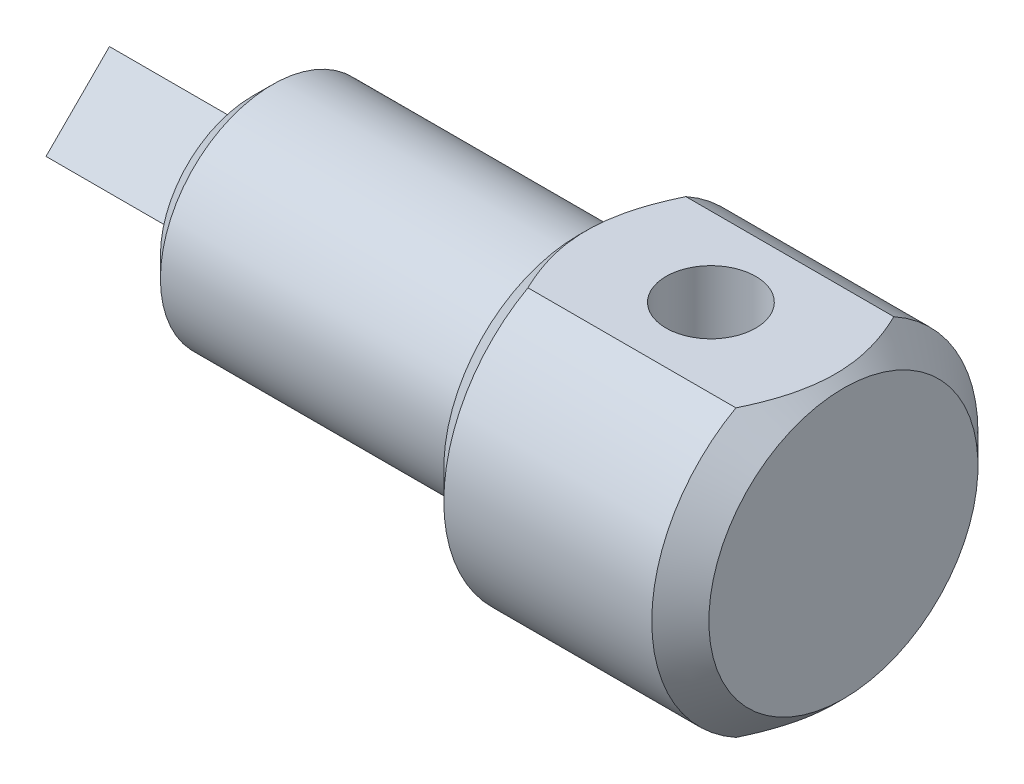
ISO-10303-21;
HEADER;
FILE_DESCRIPTION(('STEP AP214'),'2;1');
FILE_NAME('part.step','',(''),(''),'','','');
FILE_SCHEMA(('AUTOMOTIVE_DESIGN { 1 0 10303 214 1 1 1 1 }'));
ENDSEC;
DATA;
#1=APPLICATION_CONTEXT('core data for automotive mechanical design processes');
#2=APPLICATION_PROTOCOL_DEFINITION('international standard','automotive_design',2000,#1);
#3=PRODUCT_CONTEXT('',#1,'mechanical');
#4=PRODUCT('Part','Part','',(#3));
#5=PRODUCT_RELATED_PRODUCT_CATEGORY('part','',(#4));
#6=PRODUCT_DEFINITION_FORMATION('','',#4);
#7=PRODUCT_DEFINITION_CONTEXT('part definition',#1,'design');
#8=PRODUCT_DEFINITION('design','',#6,#7);
#9=PRODUCT_DEFINITION_SHAPE('','',#8);
#10=(LENGTH_UNIT() NAMED_UNIT(*) SI_UNIT(.MILLI.,.METRE.));
#11=(NAMED_UNIT(*) PLANE_ANGLE_UNIT() SI_UNIT($,.RADIAN.));
#12=(NAMED_UNIT(*) SI_UNIT($,.STERADIAN.) SOLID_ANGLE_UNIT());
#13=UNCERTAINTY_MEASURE_WITH_UNIT(LENGTH_MEASURE(1.E-05),#10,'distance_accuracy_value','');
#14=(GEOMETRIC_REPRESENTATION_CONTEXT(3) GLOBAL_UNCERTAINTY_ASSIGNED_CONTEXT((#13)) GLOBAL_UNIT_ASSIGNED_CONTEXT((#10,
#11,#12)) REPRESENTATION_CONTEXT('',''));
#15=CARTESIAN_POINT('',(0.,0.,0.));
#16=DIRECTION('',(0.,0.,1.));
#17=DIRECTION('',(1.,0.,0.));
#18=AXIS2_PLACEMENT_3D('',#15,#16,#17);
#19=CARTESIAN_POINT('',(0.,0.,0.));
#20=DIRECTION('',(1.,0.,0.));
#21=DIRECTION('',(0.,0.,-1.));
#22=AXIS2_PLACEMENT_3D('',#19,#20,#21);
#23=CYLINDRICAL_SURFACE('',#22,40.);
#24=DIRECTION('',(-1.,0.,0.));
#25=VECTOR('',#24,1.);
#26=CARTESIAN_POINT('',(489.715486354475,-35.,19.3649167310371));
#27=LINE('',#26,#25);
#28=CARTESIAN_POINT('',(138.,-35.,19.3649167310371));
#29=VERTEX_POINT('',#28);
#30=CARTESIAN_POINT('',(87.,-35.,19.3649167310371));
#31=VERTEX_POINT('',#30);
#32=EDGE_CURVE('E324',#29,#31,#27,.T.);
#33=ORIENTED_EDGE('',*,*,#32,.F.);
#34=CARTESIAN_POINT('',(138.,0.,0.));
#35=DIRECTION('',(-1.,0.,0.));
#36=DIRECTION('',(0.,0.,1.));
#37=AXIS2_PLACEMENT_3D('',#34,#35,#36);
#38=CIRCLE('',#37,40.);
#39=CARTESIAN_POINT('',(138.,35.,19.3649167310371));
#40=VERTEX_POINT('',#39);
#41=EDGE_CURVE('E327',#29,#40,#38,.T.);
#42=ORIENTED_EDGE('',*,*,#41,.T.);
#43=DIRECTION('',(-1.,0.,0.));
#44=VECTOR('',#43,1.);
#45=CARTESIAN_POINT('',(592.003645318366,35.,19.3649167310371));
#46=LINE('',#45,#44);
#47=CARTESIAN_POINT('',(87.0000000000002,35.,19.3649167310371));
#48=VERTEX_POINT('',#47);
#49=EDGE_CURVE('E341',#40,#48,#46,.T.);
#50=ORIENTED_EDGE('',*,*,#49,.T.);
#51=CARTESIAN_POINT('',(87.,0.,0.));
#52=DIRECTION('',(1.,0.,0.));
#53=DIRECTION('',(0.,0.,-1.));
#54=AXIS2_PLACEMENT_3D('',#51,#52,#53);
#55=CIRCLE('',#54,40.);
#56=EDGE_CURVE('E330',#48,#31,#55,.T.);
#57=ORIENTED_EDGE('',*,*,#56,.T.);
#58=EDGE_LOOP('',(#33,#42,#50,#57));
#59=FACE_BOUND('',#58,.T.);
#60=ADVANCED_FACE('F35',(#59),#23,.T.);
#61=CARTESIAN_POINT('',(80.,27.5,0.));
#62=DIRECTION('',(-1.,0.,0.));
#63=DIRECTION('',(0.,0.,1.));
#64=AXIS2_PLACEMENT_3D('',#61,#62,#63);
#65=PLANE('',#64);
#66=CARTESIAN_POINT('',(80.,0.,0.));
#67=DIRECTION('',(-1.,0.,0.));
#68=DIRECTION('',(0.,0.,1.));
#69=AXIS2_PLACEMENT_3D('',#66,#67,#68);
#70=CIRCLE('',#69,33.);
#71=CARTESIAN_POINT('',(80.,-28.875,-15.9760563031056));
#72=VERTEX_POINT('',#71);
#73=EDGE_CURVE('E48',#72,#72,#70,.T.);
#74=ORIENTED_EDGE('',*,*,#73,.T.);
#75=EDGE_LOOP('',(#74));
#76=FACE_BOUND('',#75,.T.);
#77=CARTESIAN_POINT('',(80.,0.,0.));
#78=DIRECTION('',(1.,0.,0.));
#79=DIRECTION('',(0.,0.,-1.));
#80=AXIS2_PLACEMENT_3D('',#77,#78,#79);
#81=CIRCLE('',#80,27.5);
#82=CARTESIAN_POINT('',(80.,0.,-27.5));
#83=VERTEX_POINT('',#82);
#84=EDGE_CURVE('E197',#83,#83,#81,.T.);
#85=ORIENTED_EDGE('',*,*,#84,.T.);
#86=EDGE_LOOP('',(#85));
#87=FACE_BOUND('',#86,.T.);
#88=ADVANCED_FACE('F276',(#76,#87),#65,.T.);
#89=DIRECTION('',(-1.,0.,0.));
#90=VECTOR('',#89,1.);
#91=CARTESIAN_POINT('',(592.003645318366,35.,-19.3649167310371));
#92=LINE('',#91,#90);
#93=CARTESIAN_POINT('',(138.,35.,-19.3649167310371));
#94=VERTEX_POINT('',#93);
#95=CARTESIAN_POINT('',(87.0000000000002,35.,-19.3649167310371));
#96=VERTEX_POINT('',#95);
#97=EDGE_CURVE('E159',#94,#96,#92,.T.);
#98=ORIENTED_EDGE('',*,*,#97,.F.);
#99=CARTESIAN_POINT('',(138.,0.,0.));
#100=DIRECTION('',(1.,0.,0.));
#101=DIRECTION('',(0.,0.,-1.));
#102=AXIS2_PLACEMENT_3D('',#99,#100,#101);
#103=CIRCLE('',#102,40.);
#104=CARTESIAN_POINT('',(138.,-35.,-19.3649167310371));
#105=VERTEX_POINT('',#104);
#106=EDGE_CURVE('E211',#94,#105,#103,.F.);
#107=ORIENTED_EDGE('',*,*,#106,.T.);
#108=DIRECTION('',(-1.,0.,0.));
#109=VECTOR('',#108,1.);
#110=CARTESIAN_POINT('',(489.715486354475,-35.,-19.3649167310371));
#111=LINE('',#110,#109);
#112=CARTESIAN_POINT('',(87.,-35.,-19.3649167310371));
#113=VERTEX_POINT('',#112);
#114=EDGE_CURVE('E333',#105,#113,#111,.T.);
#115=ORIENTED_EDGE('',*,*,#114,.T.);
#116=CARTESIAN_POINT('',(87.,0.,0.));
#117=DIRECTION('',(-1.,0.,0.));
#118=DIRECTION('',(0.,0.,1.));
#119=AXIS2_PLACEMENT_3D('',#116,#117,#118);
#120=CIRCLE('',#119,40.);
#121=EDGE_CURVE('E208',#113,#96,#120,.F.);
#122=ORIENTED_EDGE('',*,*,#121,.T.);
#123=EDGE_LOOP('',(#98,#107,#115,#122));
#124=FACE_BOUND('',#123,.T.);
#125=ADVANCED_FACE('F279',(#124),#23,.T.);
#126=CARTESIAN_POINT('',(145.,40.,0.));
#127=DIRECTION('',(1.,0.,0.));
#128=DIRECTION('',(0.,0.,-1.));
#129=AXIS2_PLACEMENT_3D('',#126,#127,#128);
#130=PLANE('',#129);
#131=CARTESIAN_POINT('',(145.,0.,0.));
#132=DIRECTION('',(1.,0.,0.));
#133=DIRECTION('',(0.,0.,-1.));
#134=AXIS2_PLACEMENT_3D('',#131,#132,#133);
#135=CIRCLE('',#134,33.);
#136=CARTESIAN_POINT('',(145.,-28.875,-15.9760563031056));
#137=VERTEX_POINT('',#136);
#138=EDGE_CURVE('E53',#137,#137,#135,.T.);
#139=ORIENTED_EDGE('',*,*,#138,.T.);
#140=EDGE_LOOP('',(#139));
#141=FACE_BOUND('',#140,.T.);
#142=ADVANCED_FACE('F274',(#141),#130,.T.);
#143=CARTESIAN_POINT('',(0.,0.,0.));
#144=DIRECTION('',(1.,0.,0.));
#145=DIRECTION('',(0.,0.,-1.));
#146=AXIS2_PLACEMENT_3D('',#143,#144,#145);
#147=CYLINDRICAL_SURFACE('',#146,27.5);
#148=CARTESIAN_POINT('',(5.,0.,0.));
#149=DIRECTION('',(-1.,0.,0.));
#150=DIRECTION('',(0.,0.,1.));
#151=AXIS2_PLACEMENT_3D('',#148,#149,#150);
#152=CIRCLE('',#151,27.5);
#153=CARTESIAN_POINT('',(5.,0.,27.5));
#154=VERTEX_POINT('',#153);
#155=EDGE_CURVE('E43',#154,#154,#152,.F.);
#156=ORIENTED_EDGE('',*,*,#155,.T.);
#157=EDGE_LOOP('',(#156));
#158=FACE_BOUND('',#157,.T.);
#159=ORIENTED_EDGE('',*,*,#84,.F.);
#160=EDGE_LOOP('',(#159));
#161=FACE_BOUND('',#160,.T.);
#162=CARTESIAN_POINT('',(15.,0.,0.));
#163=DIRECTION('',(-1.,0.,0.));
#164=DIRECTION('',(0.,0.,1.));
#165=AXIS2_PLACEMENT_3D('',#162,#163,#164);
#166=CIRCLE('',#165,27.5);
#167=CARTESIAN_POINT('',(15.,-8.,-26.3106442338457));
#168=VERTEX_POINT('',#167);
#169=CARTESIAN_POINT('',(15.,8.,-26.3106442338457));
#170=VERTEX_POINT('',#169);
#171=EDGE_CURVE('E204',#168,#170,#166,.F.);
#172=ORIENTED_EDGE('',*,*,#171,.F.);
#173=DIRECTION('',(1.,0.,0.));
#174=VECTOR('',#173,1.);
#175=CARTESIAN_POINT('',(0.,-8.,-26.3106442338457));
#176=LINE('',#175,#174);
#177=CARTESIAN_POINT('',(60.,-8.,-26.3106442338457));
#178=VERTEX_POINT('',#177);
#179=EDGE_CURVE('E136',#168,#178,#176,.T.);
#180=ORIENTED_EDGE('',*,*,#179,.T.);
#181=CARTESIAN_POINT('',(60.,0.,0.));
#182=DIRECTION('',(1.,0.,0.));
#183=DIRECTION('',(0.,0.,-1.));
#184=AXIS2_PLACEMENT_3D('',#181,#182,#183);
#185=CIRCLE('',#184,27.5);
#186=CARTESIAN_POINT('',(60.,8.,-26.3106442338457));
#187=VERTEX_POINT('',#186);
#188=EDGE_CURVE('E202',#187,#178,#185,.F.);
#189=ORIENTED_EDGE('',*,*,#188,.F.);
#190=DIRECTION('',(1.,0.,0.));
#191=VECTOR('',#190,1.);
#192=CARTESIAN_POINT('',(0.,8.,-26.3106442338457));
#193=LINE('',#192,#191);
#194=EDGE_CURVE('E200',#170,#187,#193,.T.);
#195=ORIENTED_EDGE('',*,*,#194,.F.);
#196=EDGE_LOOP('',(#172,#180,#189,#195));
#197=FACE_BOUND('',#196,.T.);
#198=ADVANCED_FACE('F270',(#158,#161,#197),#147,.T.);
#199=CARTESIAN_POINT('',(0.,0.,0.));
#200=DIRECTION('',(-1.,0.,0.));
#201=DIRECTION('',(0.,0.,1.));
#202=AXIS2_PLACEMENT_3D('',#199,#200,#201);
#203=PLANE('',#202);
#204=CARTESIAN_POINT('',(0.,0.,0.));
#205=DIRECTION('',(-1.,0.,0.));
#206=DIRECTION('',(0.,0.,1.));
#207=AXIS2_PLACEMENT_3D('',#204,#205,#206);
#208=CIRCLE('',#207,22.5);
#209=CARTESIAN_POINT('',(0.,0.,22.5));
#210=VERTEX_POINT('',#209);
#211=EDGE_CURVE('E11',#210,#210,#208,.T.);
#212=ORIENTED_EDGE('',*,*,#211,.T.);
#213=EDGE_LOOP('',(#212));
#214=FACE_BOUND('',#213,.T.);
#215=DIRECTION('',(0.,0.707106781186548,0.707106781186547));
#216=VECTOR('',#215,1.);
#217=CARTESIAN_POINT('',(0.,-15.556349186104,0.));
#218=LINE('',#217,#216);
#219=CARTESIAN_POINT('',(0.,-15.556349186104,0.));
#220=VERTEX_POINT('',#219);
#221=CARTESIAN_POINT('',(0.,0.,15.556349186104));
#222=VERTEX_POINT('',#221);
#223=EDGE_CURVE('E163',#220,#222,#218,.T.);
#224=ORIENTED_EDGE('',*,*,#223,.F.);
#225=DIRECTION('',(0.,-0.707106781186547,0.707106781186548));
#226=VECTOR('',#225,1.);
#227=CARTESIAN_POINT('',(0.,-15.556349186104,0.));
#228=LINE('',#227,#226);
#229=CARTESIAN_POINT('',(0.,0.,-15.556349186104));
#230=VERTEX_POINT('',#229);
#231=EDGE_CURVE('E169',#230,#220,#228,.T.);
#232=ORIENTED_EDGE('',*,*,#231,.F.);
#233=DIRECTION('',(0.,-0.707106781186548,-0.707106781186548));
#234=VECTOR('',#233,1.);
#235=CARTESIAN_POINT('',(0.,0.,-15.556349186104));
#236=LINE('',#235,#234);
#237=CARTESIAN_POINT('',(0.,15.5563491861041,0.));
#238=VERTEX_POINT('',#237);
#239=EDGE_CURVE('E181',#238,#230,#236,.T.);
#240=ORIENTED_EDGE('',*,*,#239,.F.);
#241=DIRECTION('',(0.,0.707106781186547,-0.707106781186548));
#242=VECTOR('',#241,1.);
#243=CARTESIAN_POINT('',(0.,0.,15.556349186104));
#244=LINE('',#243,#242);
#245=EDGE_CURVE('E178',#222,#238,#244,.T.);
#246=ORIENTED_EDGE('',*,*,#245,.F.);
#247=EDGE_LOOP('',(#224,#232,#240,#246));
#248=FACE_BOUND('',#247,.T.);
#249=ADVANCED_FACE('F265',(#214,#248),#203,.T.);
#250=CARTESIAN_POINT('',(-35.,-15.556349186104,0.));
#251=DIRECTION('',(0.,0.707106781186548,-0.707106781186548));
#252=DIRECTION('',(0.,0.707106781186548,0.707106781186547));
#253=AXIS2_PLACEMENT_3D('',#250,#251,#252);
#254=PLANE('',#253);
#255=ORIENTED_EDGE('',*,*,#223,.T.);
#256=DIRECTION('',(1.,0.,0.));
#257=VECTOR('',#256,1.);
#258=CARTESIAN_POINT('',(-35.,0.,15.556349186104));
#259=LINE('',#258,#257);
#260=CARTESIAN_POINT('',(-35.,0.,15.556349186104));
#261=VERTEX_POINT('',#260);
#262=EDGE_CURVE('E194',#261,#222,#259,.T.);
#263=ORIENTED_EDGE('',*,*,#262,.F.);
#264=DIRECTION('',(0.,0.707106781186548,0.707106781186547));
#265=VECTOR('',#264,1.);
#266=CARTESIAN_POINT('',(-35.,-15.556349186104,0.));
#267=LINE('',#266,#265);
#268=CARTESIAN_POINT('',(-35.,-15.556349186104,0.));
#269=VERTEX_POINT('',#268);
#270=EDGE_CURVE('E165',#269,#261,#267,.T.);
#271=ORIENTED_EDGE('',*,*,#270,.F.);
#272=DIRECTION('',(1.,0.,0.));
#273=VECTOR('',#272,1.);
#274=CARTESIAN_POINT('',(-35.,-15.556349186104,0.));
#275=LINE('',#274,#273);
#276=EDGE_CURVE('E175',#269,#220,#275,.T.);
#277=ORIENTED_EDGE('',*,*,#276,.T.);
#278=EDGE_LOOP('',(#255,#263,#271,#277));
#279=FACE_BOUND('',#278,.T.);
#280=ADVANCED_FACE('F269',(#279),#254,.F.);
#281=CARTESIAN_POINT('',(-35.,0.,15.556349186104));
#282=DIRECTION('',(0.,-0.707106781186548,-0.707106781186547));
#283=DIRECTION('',(0.,0.707106781186547,-0.707106781186548));
#284=AXIS2_PLACEMENT_3D('',#281,#282,#283);
#285=PLANE('',#284);
#286=ORIENTED_EDGE('',*,*,#245,.T.);
#287=DIRECTION('',(1.,0.,0.));
#288=VECTOR('',#287,1.);
#289=CARTESIAN_POINT('',(-35.,15.5563491861041,0.));
#290=LINE('',#289,#288);
#291=CARTESIAN_POINT('',(-35.,15.5563491861041,0.));
#292=VERTEX_POINT('',#291);
#293=EDGE_CURVE('E191',#292,#238,#290,.T.);
#294=ORIENTED_EDGE('',*,*,#293,.F.);
#295=DIRECTION('',(0.,0.707106781186547,-0.707106781186548));
#296=VECTOR('',#295,1.);
#297=CARTESIAN_POINT('',(-35.,0.,15.556349186104));
#298=LINE('',#297,#296);
#299=EDGE_CURVE('E168',#261,#292,#298,.T.);
#300=ORIENTED_EDGE('',*,*,#299,.F.);
#301=ORIENTED_EDGE('',*,*,#262,.T.);
#302=EDGE_LOOP('',(#286,#294,#300,#301));
#303=FACE_BOUND('',#302,.T.);
#304=ADVANCED_FACE('F289',(#303),#285,.F.);
#305=CARTESIAN_POINT('',(-35.,0.,-15.556349186104));
#306=DIRECTION('',(0.,-0.707106781186548,0.707106781186548));
#307=DIRECTION('',(0.,-0.707106781186548,-0.707106781186548));
#308=AXIS2_PLACEMENT_3D('',#305,#306,#307);
#309=PLANE('',#308);
#310=ORIENTED_EDGE('',*,*,#239,.T.);
#311=DIRECTION('',(1.,0.,0.));
#312=VECTOR('',#311,1.);
#313=CARTESIAN_POINT('',(-35.,0.,-15.556349186104));
#314=LINE('',#313,#312);
#315=CARTESIAN_POINT('',(-35.,0.,-15.556349186104));
#316=VERTEX_POINT('',#315);
#317=EDGE_CURVE('E188',#316,#230,#314,.T.);
#318=ORIENTED_EDGE('',*,*,#317,.F.);
#319=DIRECTION('',(0.,-0.707106781186548,-0.707106781186548));
#320=VECTOR('',#319,1.);
#321=CARTESIAN_POINT('',(-35.,0.,-15.556349186104));
#322=LINE('',#321,#320);
#323=EDGE_CURVE('E171',#292,#316,#322,.T.);
#324=ORIENTED_EDGE('',*,*,#323,.F.);
#325=ORIENTED_EDGE('',*,*,#293,.T.);
#326=EDGE_LOOP('',(#310,#318,#324,#325));
#327=FACE_BOUND('',#326,.T.);
#328=ADVANCED_FACE('F293',(#327),#309,.F.);
#329=CARTESIAN_POINT('',(-35.,-15.556349186104,0.));
#330=DIRECTION('',(0.,0.707106781186548,0.707106781186547));
#331=DIRECTION('',(0.,-0.707106781186547,0.707106781186548));
#332=AXIS2_PLACEMENT_3D('',#329,#330,#331);
#333=PLANE('',#332);
#334=ORIENTED_EDGE('',*,*,#231,.T.);
#335=ORIENTED_EDGE('',*,*,#276,.F.);
#336=DIRECTION('',(0.,-0.707106781186547,0.707106781186548));
#337=VECTOR('',#336,1.);
#338=CARTESIAN_POINT('',(-35.,-15.556349186104,0.));
#339=LINE('',#338,#337);
#340=EDGE_CURVE('E173',#316,#269,#339,.T.);
#341=ORIENTED_EDGE('',*,*,#340,.F.);
#342=ORIENTED_EDGE('',*,*,#317,.T.);
#343=EDGE_LOOP('',(#334,#335,#341,#342));
#344=FACE_BOUND('',#343,.T.);
#345=ADVANCED_FACE('F297',(#344),#333,.F.);
#346=CARTESIAN_POINT('',(-35.,0.,0.));
#347=DIRECTION('',(-1.,0.,0.));
#348=DIRECTION('',(0.,0.,1.));
#349=AXIS2_PLACEMENT_3D('',#346,#347,#348);
#350=PLANE('',#349);
#351=ORIENTED_EDGE('',*,*,#270,.T.);
#352=ORIENTED_EDGE('',*,*,#299,.T.);
#353=ORIENTED_EDGE('',*,*,#323,.T.);
#354=ORIENTED_EDGE('',*,*,#340,.T.);
#355=EDGE_LOOP('',(#351,#352,#353,#354));
#356=FACE_BOUND('',#355,.T.);
#357=ADVANCED_FACE('F301',(#356),#350,.T.);
#358=CARTESIAN_POINT('',(15.,-8.,-27.5));
#359=DIRECTION('',(-1.,0.,0.));
#360=DIRECTION('',(0.,0.,1.));
#361=AXIS2_PLACEMENT_3D('',#358,#359,#360);
#362=PLANE('',#361);
#363=DIRECTION('',(0.,0.,1.));
#364=VECTOR('',#363,1.);
#365=CARTESIAN_POINT('',(15.,-8.,-27.5));
#366=LINE('',#365,#364);
#367=CARTESIAN_POINT('',(15.,-8.,-22.5));
#368=VERTEX_POINT('',#367);
#369=EDGE_CURVE('E129',#168,#368,#366,.T.);
#370=ORIENTED_EDGE('',*,*,#369,.F.);
#371=ORIENTED_EDGE('',*,*,#171,.T.);
#372=DIRECTION('',(0.,0.,1.));
#373=VECTOR('',#372,1.);
#374=CARTESIAN_POINT('',(15.,8.,-27.5));
#375=LINE('',#374,#373);
#376=CARTESIAN_POINT('',(15.,8.,-22.5));
#377=VERTEX_POINT('',#376);
#378=EDGE_CURVE('E144',#170,#377,#375,.T.);
#379=ORIENTED_EDGE('',*,*,#378,.T.);
#380=DIRECTION('',(0.,1.,0.));
#381=VECTOR('',#380,1.);
#382=CARTESIAN_POINT('',(15.,-8.,-22.5));
#383=LINE('',#382,#381);
#384=EDGE_CURVE('E142',#368,#377,#383,.T.);
#385=ORIENTED_EDGE('',*,*,#384,.F.);
#386=EDGE_LOOP('',(#370,#371,#379,#385));
#387=FACE_BOUND('',#386,.T.);
#388=ADVANCED_FACE('F143',(#387),#362,.F.);
#389=CARTESIAN_POINT('',(60.,-8.,-27.5));
#390=DIRECTION('',(1.,0.,0.));
#391=DIRECTION('',(0.,0.,-1.));
#392=AXIS2_PLACEMENT_3D('',#389,#390,#391);
#393=PLANE('',#392);
#394=ORIENTED_EDGE('',*,*,#188,.T.);
#395=DIRECTION('',(0.,0.,-1.));
#396=VECTOR('',#395,1.);
#397=CARTESIAN_POINT('',(60.,-8.,-27.5));
#398=LINE('',#397,#396);
#399=CARTESIAN_POINT('',(60.,-8.,-22.5));
#400=VERTEX_POINT('',#399);
#401=EDGE_CURVE('E149',#400,#178,#398,.T.);
#402=ORIENTED_EDGE('',*,*,#401,.F.);
#403=DIRECTION('',(0.,1.,0.));
#404=VECTOR('',#403,1.);
#405=CARTESIAN_POINT('',(60.,-8.,-22.5));
#406=LINE('',#405,#404);
#407=CARTESIAN_POINT('',(60.,8.,-22.5));
#408=VERTEX_POINT('',#407);
#409=EDGE_CURVE('E148',#400,#408,#406,.T.);
#410=ORIENTED_EDGE('',*,*,#409,.T.);
#411=DIRECTION('',(0.,0.,-1.));
#412=VECTOR('',#411,1.);
#413=CARTESIAN_POINT('',(60.,8.,-27.5));
#414=LINE('',#413,#412);
#415=EDGE_CURVE('E139',#408,#187,#414,.T.);
#416=ORIENTED_EDGE('',*,*,#415,.T.);
#417=EDGE_LOOP('',(#394,#402,#410,#416));
#418=FACE_BOUND('',#417,.T.);
#419=ADVANCED_FACE('F308',(#418),#393,.F.);
#420=CARTESIAN_POINT('',(15.,-8.,-22.5));
#421=DIRECTION('',(0.,0.,1.));
#422=DIRECTION('',(1.,0.,0.));
#423=AXIS2_PLACEMENT_3D('',#420,#421,#422);
#424=PLANE('',#423);
#425=DIRECTION('',(1.,0.,0.));
#426=VECTOR('',#425,1.);
#427=CARTESIAN_POINT('',(15.,8.,-22.5));
#428=LINE('',#427,#426);
#429=EDGE_CURVE('E158',#377,#408,#428,.T.);
#430=ORIENTED_EDGE('',*,*,#429,.T.);
#431=ORIENTED_EDGE('',*,*,#409,.F.);
#432=DIRECTION('',(1.,0.,0.));
#433=VECTOR('',#432,1.);
#434=CARTESIAN_POINT('',(15.,-8.,-22.5));
#435=LINE('',#434,#433);
#436=EDGE_CURVE('E134',#368,#400,#435,.T.);
#437=ORIENTED_EDGE('',*,*,#436,.F.);
#438=ORIENTED_EDGE('',*,*,#384,.T.);
#439=EDGE_LOOP('',(#430,#431,#437,#438));
#440=FACE_BOUND('',#439,.T.);
#441=ADVANCED_FACE('F151',(#440),#424,.F.);
#442=CARTESIAN_POINT('',(0.,-8.,0.));
#443=DIRECTION('',(0.,1.,0.));
#444=DIRECTION('',(0.,0.,1.));
#445=AXIS2_PLACEMENT_3D('',#442,#443,#444);
#446=PLANE('',#445);
#447=ORIENTED_EDGE('',*,*,#369,.T.);
#448=ORIENTED_EDGE('',*,*,#436,.T.);
#449=ORIENTED_EDGE('',*,*,#401,.T.);
#450=ORIENTED_EDGE('',*,*,#179,.F.);
#451=EDGE_LOOP('',(#447,#448,#449,#450));
#452=FACE_BOUND('',#451,.T.);
#453=ADVANCED_FACE('F131',(#452),#446,.T.);
#454=CARTESIAN_POINT('',(0.,8.,0.));
#455=DIRECTION('',(0.,1.,0.));
#456=DIRECTION('',(0.,0.,1.));
#457=AXIS2_PLACEMENT_3D('',#454,#455,#456);
#458=PLANE('',#457);
#459=ORIENTED_EDGE('',*,*,#194,.T.);
#460=ORIENTED_EDGE('',*,*,#415,.F.);
#461=ORIENTED_EDGE('',*,*,#429,.F.);
#462=ORIENTED_EDGE('',*,*,#378,.F.);
#463=EDGE_LOOP('',(#459,#460,#461,#462));
#464=FACE_BOUND('',#463,.T.);
#465=ADVANCED_FACE('F242',(#464),#458,.F.);
#466=CARTESIAN_POINT('',(592.003645318366,35.,19.3649167310371));
#467=DIRECTION('',(0.,1.,0.));
#468=DIRECTION('',(0.,0.,1.));
#469=AXIS2_PLACEMENT_3D('',#466,#467,#468);
#470=PLANE('',#469);
#471=CARTESIAN_POINT('',(112.5,35.,0.));
#472=DIRECTION('',(0.,1.,0.));
#473=DIRECTION('',(0.,0.,1.));
#474=AXIS2_PLACEMENT_3D('',#471,#472,#473);
#475=CIRCLE('',#474,11.);
#476=CARTESIAN_POINT('',(112.5,35.,11.));
#477=VERTEX_POINT('',#476);
#478=EDGE_CURVE('E334',#477,#477,#475,.T.);
#479=ORIENTED_EDGE('',*,*,#478,.F.);
#480=EDGE_LOOP('',(#479));
#481=FACE_BOUND('',#480,.T.);
#482=ORIENTED_EDGE('',*,*,#49,.F.);
#483=CARTESIAN_POINT('',(138.,35.,19.3649167310371));
#484=CARTESIAN_POINT('',(138.326094827656,35.,18.6912387485128));
#485=CARTESIAN_POINT('',(138.641761997358,35.,18.0123808741172));
#486=CARTESIAN_POINT('',(139.249096776026,35.,16.6436134748675));
#487=CARTESIAN_POINT('',(139.540751901741,35.,15.9536984215469));
#488=CARTESIAN_POINT('',(140.097970184273,35.,14.5593278395373));
#489=CARTESIAN_POINT('',(140.363394957766,35.,13.8548166902059));
#490=CARTESIAN_POINT('',(140.862667715037,35.,12.4347573540583));
#491=CARTESIAN_POINT('',(141.096520422169,35.,11.7192108360804));
#492=CARTESIAN_POINT('',(141.523544011081,35.,10.294767065239));
#493=CARTESIAN_POINT('',(141.717558174331,35.,9.58612390784976));
#494=CARTESIAN_POINT('',(142.068118657258,35.,8.15953670708846));
#495=CARTESIAN_POINT('',(142.224663355978,35.,7.44159226275176));
#496=CARTESIAN_POINT('',(142.496580023012,35.,5.99943254517989));
#497=CARTESIAN_POINT('',(142.612035998696,35.,5.27523320370804));
#498=CARTESIAN_POINT('',(142.799396472638,35.,3.82124225809192));
#499=CARTESIAN_POINT('',(142.871306284498,35.,3.0914513472531));
#500=CARTESIAN_POINT('',(142.957217946309,35.,1.81468474344199));
#501=CARTESIAN_POINT('',(142.98129035747,35.,1.26836836440829));
#502=CARTESIAN_POINT('',(143.003825995438,35.,0.175214721191131));
#503=CARTESIAN_POINT('',(143.002290318266,35.,-0.371622519697841));
#504=CARTESIAN_POINT('',(142.973624903149,35.,-1.46480039860722));
#505=CARTESIAN_POINT('',(142.946486693608,35.,-2.01114081233564));
#506=CARTESIAN_POINT('',(142.867018109838,35.,-3.10199012443684));
#507=CARTESIAN_POINT('',(142.814687221568,35.,-3.64649898520966));
#508=CARTESIAN_POINT('',(142.685175540994,35.,-4.73618336599739));
#509=CARTESIAN_POINT('',(142.607833194012,35.,-5.28133961440485));
#510=CARTESIAN_POINT('',(142.429492327136,35.,-6.36774486424979));
#511=CARTESIAN_POINT('',(142.328494023192,35.,-6.90899390130922));
#512=CARTESIAN_POINT('',(142.104180403818,35.,-7.98671319343688));
#513=CARTESIAN_POINT('',(141.980870157707,35.,-8.52318450502445));
#514=CARTESIAN_POINT('',(141.713382122625,35.,-9.5909302497607));
#515=CARTESIAN_POINT('',(141.569200967038,35.,-10.1222038296926));
#516=CARTESIAN_POINT('',(140.936502799507,35.,-12.2954430140768));
#517=CARTESIAN_POINT('',(140.363847852573,35.,-13.9135365902734));
#518=CARTESIAN_POINT('',(139.398561060932,35.,-16.2972788696919));
#519=CARTESIAN_POINT('',(139.058659070435,35.,-17.0854495975228));
#520=CARTESIAN_POINT('',(138.348241510134,35.,-18.6479420186928));
#521=CARTESIAN_POINT('',(137.977727775361,35.,-19.4222645387875));
#522=CARTESIAN_POINT('',(137.214187197739,35.,-20.9503331433842));
#523=CARTESIAN_POINT('',(136.821411027676,35.,-21.704205477112));
#524=CARTESIAN_POINT('',(136.013740065378,35.,-23.2000492626719));
#525=CARTESIAN_POINT('',(135.598843728498,35.,-23.9420198786914));
#526=CARTESIAN_POINT('',(134.752059019969,35.,-25.4114791660679));
#527=CARTESIAN_POINT('',(134.320260825215,35.,-26.1390199227259));
#528=CARTESIAN_POINT('',(133.66042480319,35.,-27.2227834963373));
#529=CARTESIAN_POINT('',(133.43848372707,35.,-27.5827373126327));
#530=CARTESIAN_POINT('',(132.990814208094,35.,-28.3002714502337));
#531=CARTESIAN_POINT('',(132.765085850181,35.,-28.6578518245217));
#532=CARTESIAN_POINT('',(132.537596137154,35.,-29.0143096590029));
#533=B_SPLINE_CURVE_WITH_KNOTS('',3,(#483,#484,#485,#486,#487,#488,#489,#490,#491,#492,#493,
#494,#495,#496,#497,#498,#499,#500,#501,#502,#503,#504,#505,#506,#507,#508,#509,#510,#511,#512,
#513,#514,#515,#516,#517,#518,#519,#520,#521,#522,#523,#524,#525,#526,#527,#528,#529,#530,#531,
#532),.UNSPECIFIED.,.F.,.F.,(4,2,2,2,2,2,2,2,2,2,2,2,2,2,2,2,2,2,2,2,2,2,2,2,4),(0.,
2.24544199148128,4.49204405517333,6.74992807230897,9.00747392249053,11.2107147067984,
13.4140507876929,15.6128558324876,17.8113925200005,19.4513700159063,21.0912773212494,
22.7317274443218,24.372211041153,26.0235099362378,27.6747937574113,29.3257028734532,
30.9768785893384,36.1151690071052,38.6898498765446,41.2643765176575,43.8141529146595,
46.3641075957042,48.901937369831,50.1705475454883,51.4391293060649),.UNSPECIFIED.);
#534=EDGE_CURVE('E254',#40,#94,#533,.T.);
#535=ORIENTED_EDGE('',*,*,#534,.T.);
#536=ORIENTED_EDGE('',*,*,#97,.T.);
#537=CARTESIAN_POINT('',(87.,35.,-19.3649167310371));
#538=CARTESIAN_POINT('',(86.6739051723443,35.,-18.6912387485128));
#539=CARTESIAN_POINT('',(86.3582380026419,35.,-18.0123808741173));
#540=CARTESIAN_POINT('',(85.7509032239743,35.,-16.6436134748675));
#541=CARTESIAN_POINT('',(85.4592480982589,35.,-15.9536984215469));
#542=CARTESIAN_POINT('',(84.9020298157272,35.,-14.5593278395373));
#543=CARTESIAN_POINT('',(84.6366050422342,35.,-13.8548166902059));
#544=CARTESIAN_POINT('',(84.1373322849626,35.,-12.4347573540583));
#545=CARTESIAN_POINT('',(83.9034795778309,35.,-11.7192108360804));
#546=CARTESIAN_POINT('',(83.4764559889186,35.,-10.294767065239));
#547=CARTESIAN_POINT('',(83.2824418256686,35.,-9.58612390784975));
#548=CARTESIAN_POINT('',(82.9318813427418,35.,-8.15953670708845));
#549=CARTESIAN_POINT('',(82.7753366440215,35.,-7.44159226275174));
#550=CARTESIAN_POINT('',(82.5034199769881,35.,-5.99943254517988));
#551=CARTESIAN_POINT('',(82.3879640013036,35.,-5.27523320370803));
#552=CARTESIAN_POINT('',(82.2006035273616,35.,-3.82124225809191));
#553=CARTESIAN_POINT('',(82.1286937155022,35.,-3.09145134725308));
#554=CARTESIAN_POINT('',(82.0427820536909,35.,-1.81468474344196));
#555=CARTESIAN_POINT('',(82.0187096425296,35.,-1.26836836440826));
#556=CARTESIAN_POINT('',(81.9961740045621,35.,-0.175214721191099));
#557=CARTESIAN_POINT('',(81.9977096817343,35.,0.371622519697877));
#558=CARTESIAN_POINT('',(82.0263750968506,35.,1.46480039860726));
#559=CARTESIAN_POINT('',(82.0535133063918,35.,2.01114081233568));
#560=CARTESIAN_POINT('',(82.1329818901625,35.,3.10199012443689));
#561=CARTESIAN_POINT('',(82.1853127784324,35.,3.64649898520971));
#562=CARTESIAN_POINT('',(82.3148244590065,35.,4.73618336599745));
#563=CARTESIAN_POINT('',(82.3921668059875,35.,5.28133961440491));
#564=CARTESIAN_POINT('',(82.5705076728644,35.,6.36774486424985));
#565=CARTESIAN_POINT('',(82.6715059768081,35.,6.90899390130928));
#566=CARTESIAN_POINT('',(82.8958195961825,35.,7.98671319343696));
#567=CARTESIAN_POINT('',(83.0191298422931,35.,8.52318450502454));
#568=CARTESIAN_POINT('',(83.2866178773754,35.,9.59093024976079));
#569=CARTESIAN_POINT('',(83.4307990329618,35.,10.1222038296927));
#570=CARTESIAN_POINT('',(84.0634972004926,35.,12.2954430140769));
#571=CARTESIAN_POINT('',(84.636152147427,35.,13.9135365902735));
#572=CARTESIAN_POINT('',(85.6014389390677,35.,16.297278869692));
#573=CARTESIAN_POINT('',(85.9413409295648,35.,17.0854495975229));
#574=CARTESIAN_POINT('',(86.6517584898664,35.,18.6479420186929));
#575=CARTESIAN_POINT('',(87.0222722246392,35.,19.4222645387876));
#576=CARTESIAN_POINT('',(87.7858128022612,35.,20.9503331433843));
#577=CARTESIAN_POINT('',(88.1785889723243,35.,21.7042054771122));
#578=CARTESIAN_POINT('',(88.9862599346219,35.,23.2000492626721));
#579=CARTESIAN_POINT('',(89.4011562715023,35.,23.9420198786916));
#580=CARTESIAN_POINT('',(90.2479409800308,35.,25.4114791660681));
#581=CARTESIAN_POINT('',(90.6797391747847,35.,26.1390199227262));
#582=CARTESIAN_POINT('',(91.3395751968103,35.,27.2227834963376));
#583=CARTESIAN_POINT('',(91.5615162729302,35.,27.5827373126329));
#584=CARTESIAN_POINT('',(92.0091857919063,35.,28.3002714502339));
#585=CARTESIAN_POINT('',(92.2349141498195,35.,28.6578518245219));
#586=CARTESIAN_POINT('',(92.462403862846,35.,29.0143096590032));
#587=B_SPLINE_CURVE_WITH_KNOTS('',3,(#537,#538,#539,#540,#541,#542,#543,#544,#545,#546,#547,
#548,#549,#550,#551,#552,#553,#554,#555,#556,#557,#558,#559,#560,#561,#562,#563,#564,#565,#566,
#567,#568,#569,#570,#571,#572,#573,#574,#575,#576,#577,#578,#579,#580,#581,#582,#583,#584,#585,
#586),.UNSPECIFIED.,.F.,.F.,(4,2,2,2,2,2,2,2,2,2,2,2,2,2,2,2,2,2,2,2,2,2,2,2,4),(0.,
2.24544199148127,4.49204405517333,6.74992807230897,9.00747392249053,11.2107147067985,
13.4140507876929,15.6128558324876,17.8113925200005,19.4513700159063,21.0912773212494,
22.7317274443219,24.3722110411531,26.0235099362378,27.6747937574114,29.3257028734533,
30.9768785893385,36.1151690071053,38.6898498765448,41.2643765176577,43.8141529146597,
46.3641075957045,48.9019373698313,50.1705475454886,51.4391293060653),.UNSPECIFIED.);
#588=EDGE_CURVE('E247',#96,#48,#587,.T.);
#589=ORIENTED_EDGE('',*,*,#588,.T.);
#590=EDGE_LOOP('',(#482,#535,#536,#589));
#591=FACE_BOUND('',#590,.T.);
#592=ADVANCED_FACE('F236',(#481,#591),#470,.T.);
#593=CARTESIAN_POINT('',(489.715486354475,-35.,19.3649167310371));
#594=DIRECTION('',(0.,1.,0.));
#595=DIRECTION('',(0.,0.,1.));
#596=AXIS2_PLACEMENT_3D('',#593,#594,#595);
#597=PLANE('',#596);
#598=CARTESIAN_POINT('',(112.5,-35.,0.));
#599=DIRECTION('',(0.,1.,0.));
#600=DIRECTION('',(0.,0.,1.));
#601=AXIS2_PLACEMENT_3D('',#598,#599,#600);
#602=CIRCLE('',#601,11.);
#603=CARTESIAN_POINT('',(112.5,-35.,11.));
#604=VERTEX_POINT('',#603);
#605=EDGE_CURVE('E507',#604,#604,#602,.T.);
#606=ORIENTED_EDGE('',*,*,#605,.T.);
#607=EDGE_LOOP('',(#606));
#608=FACE_BOUND('',#607,.T.);
#609=ORIENTED_EDGE('',*,*,#114,.F.);
#610=CARTESIAN_POINT('',(138.,-35.,-19.3649167310371));
#611=CARTESIAN_POINT('',(138.326094827656,-35.,-18.6912387485128));
#612=CARTESIAN_POINT('',(138.641761997358,-35.,-18.0123808741172));
#613=CARTESIAN_POINT('',(139.249096776026,-35.,-16.6436134748675));
#614=CARTESIAN_POINT('',(139.540751901741,-35.,-15.9536984215469));
#615=CARTESIAN_POINT('',(140.097970184273,-35.,-14.5593278395373));
#616=CARTESIAN_POINT('',(140.363394957766,-35.,-13.8548166902059));
#617=CARTESIAN_POINT('',(140.862667715037,-35.,-12.4347573540583));
#618=CARTESIAN_POINT('',(141.096520422169,-35.,-11.7192108360804));
#619=CARTESIAN_POINT('',(141.523544011081,-35.,-10.294767065239));
#620=CARTESIAN_POINT('',(141.717558174331,-35.,-9.58612390784976));
#621=CARTESIAN_POINT('',(142.068118657258,-35.,-8.15953670708846));
#622=CARTESIAN_POINT('',(142.224663355978,-35.,-7.44159226275175));
#623=CARTESIAN_POINT('',(142.496580023012,-35.,-5.99943254517989));
#624=CARTESIAN_POINT('',(142.612035998696,-35.,-5.27523320370804));
#625=CARTESIAN_POINT('',(142.799396472638,-35.,-3.82124225809192));
#626=CARTESIAN_POINT('',(142.871306284498,-35.,-3.0914513472531));
#627=CARTESIAN_POINT('',(142.957217946309,-35.,-1.81468474344199));
#628=CARTESIAN_POINT('',(142.98129035747,-35.,-1.26836836440829));
#629=CARTESIAN_POINT('',(143.003825995438,-35.,-0.175214721191131));
#630=CARTESIAN_POINT('',(143.002290318266,-35.,0.371622519697841));
#631=CARTESIAN_POINT('',(142.973624903149,-35.,1.46480039860722));
#632=CARTESIAN_POINT('',(142.946486693608,-35.,2.01114081233564));
#633=CARTESIAN_POINT('',(142.867018109838,-35.,3.10199012443684));
#634=CARTESIAN_POINT('',(142.814687221568,-35.,3.64649898520966));
#635=CARTESIAN_POINT('',(142.685175540994,-35.,4.73618336599739));
#636=CARTESIAN_POINT('',(142.607833194012,-35.,5.28133961440485));
#637=CARTESIAN_POINT('',(142.429492327136,-35.,6.36774486424979));
#638=CARTESIAN_POINT('',(142.328494023192,-35.,6.90899390130922));
#639=CARTESIAN_POINT('',(142.104180403818,-35.,7.98671319343689));
#640=CARTESIAN_POINT('',(141.980870157707,-35.,8.52318450502447));
#641=CARTESIAN_POINT('',(141.713382122625,-35.,9.59093024976071));
#642=CARTESIAN_POINT('',(141.569200967038,-35.,10.1222038296926));
#643=CARTESIAN_POINT('',(140.936502799507,-35.,12.2954430140768));
#644=CARTESIAN_POINT('',(140.363847852573,-35.,13.9135365902734));
#645=CARTESIAN_POINT('',(139.398561060932,-35.,16.2972788696919));
#646=CARTESIAN_POINT('',(139.058659070435,-35.,17.0854495975228));
#647=CARTESIAN_POINT('',(138.348241510134,-35.,18.6479420186928));
#648=CARTESIAN_POINT('',(137.977727775361,-35.,19.4222645387875));
#649=CARTESIAN_POINT('',(137.214187197739,-35.,20.9503331433842));
#650=CARTESIAN_POINT('',(136.821411027676,-35.,21.704205477112));
#651=CARTESIAN_POINT('',(136.013740065378,-35.,23.2000492626719));
#652=CARTESIAN_POINT('',(135.598843728498,-35.,23.9420198786914));
#653=CARTESIAN_POINT('',(134.752059019969,-35.,25.4114791660679));
#654=CARTESIAN_POINT('',(134.320260825215,-35.,26.1390199227259));
#655=CARTESIAN_POINT('',(133.66042480319,-35.,27.2227834963373));
#656=CARTESIAN_POINT('',(133.43848372707,-35.,27.5827373126327));
#657=CARTESIAN_POINT('',(132.990814208094,-35.,28.3002714502337));
#658=CARTESIAN_POINT('',(132.765085850181,-35.,28.6578518245217));
#659=CARTESIAN_POINT('',(132.537596137154,-35.,29.0143096590029));
#660=B_SPLINE_CURVE_WITH_KNOTS('',3,(#610,#611,#612,#613,#614,#615,#616,#617,#618,#619,#620,
#621,#622,#623,#624,#625,#626,#627,#628,#629,#630,#631,#632,#633,#634,#635,#636,#637,#638,#639,
#640,#641,#642,#643,#644,#645,#646,#647,#648,#649,#650,#651,#652,#653,#654,#655,#656,#657,#658,
#659),.UNSPECIFIED.,.F.,.F.,(4,2,2,2,2,2,2,2,2,2,2,2,2,2,2,2,2,2,2,2,2,2,2,2,4),(0.,
2.24544199148128,4.49204405517333,6.74992807230897,9.00747392249053,11.2107147067984,
13.4140507876929,15.6128558324876,17.8113925200005,19.4513700159063,21.0912773212494,
22.7317274443218,24.372211041153,26.0235099362378,27.6747937574113,29.3257028734532,
30.9768785893384,36.1151690071052,38.6898498765446,41.2643765176575,43.8141529146595,
46.3641075957042,48.901937369831,50.1705475454883,51.439129306065),.UNSPECIFIED.);
#661=EDGE_CURVE('E221',#105,#29,#660,.T.);
#662=ORIENTED_EDGE('',*,*,#661,.T.);
#663=ORIENTED_EDGE('',*,*,#32,.T.);
#664=CARTESIAN_POINT('',(87.,-35.,19.3649167310371));
#665=CARTESIAN_POINT('',(86.6739051723443,-35.,18.6912387485128));
#666=CARTESIAN_POINT('',(86.3582380026419,-35.,18.0123808741173));
#667=CARTESIAN_POINT('',(85.7509032239743,-35.,16.6436134748675));
#668=CARTESIAN_POINT('',(85.4592480982589,-35.,15.9536984215469));
#669=CARTESIAN_POINT('',(84.9020298157272,-35.,14.5593278395373));
#670=CARTESIAN_POINT('',(84.6366050422342,-35.,13.8548166902059));
#671=CARTESIAN_POINT('',(84.1373322849626,-35.,12.4347573540583));
#672=CARTESIAN_POINT('',(83.9034795778309,-35.,11.7192108360804));
#673=CARTESIAN_POINT('',(83.4764559889186,-35.,10.294767065239));
#674=CARTESIAN_POINT('',(83.2824418256686,-35.,9.58612390784975));
#675=CARTESIAN_POINT('',(82.9318813427418,-35.,8.15953670708845));
#676=CARTESIAN_POINT('',(82.7753366440215,-35.,7.44159226275175));
#677=CARTESIAN_POINT('',(82.5034199769881,-35.,5.99943254517988));
#678=CARTESIAN_POINT('',(82.3879640013036,-35.,5.27523320370803));
#679=CARTESIAN_POINT('',(82.2006035273616,-35.,3.8212422580919));
#680=CARTESIAN_POINT('',(82.1286937155022,-35.,3.09145134725307));
#681=CARTESIAN_POINT('',(82.0427820536909,-35.,1.81468474344196));
#682=CARTESIAN_POINT('',(82.0187096425296,-35.,1.26836836440825));
#683=CARTESIAN_POINT('',(81.9961740045621,-35.,0.175214721191088));
#684=CARTESIAN_POINT('',(81.9977096817343,-35.,-0.371622519697888));
#685=CARTESIAN_POINT('',(82.0263750968506,-35.,-1.46480039860727));
#686=CARTESIAN_POINT('',(82.0535133063918,-35.,-2.0111408123357));
#687=CARTESIAN_POINT('',(82.1329818901625,-35.,-3.10199012443691));
#688=CARTESIAN_POINT('',(82.1853127784324,-35.,-3.64649898520972));
#689=CARTESIAN_POINT('',(82.3148244590065,-35.,-4.73618336599746));
#690=CARTESIAN_POINT('',(82.3921668059875,-35.,-5.28133961440492));
#691=CARTESIAN_POINT('',(82.5705076728644,-35.,-6.36774486424987));
#692=CARTESIAN_POINT('',(82.6715059768081,-35.,-6.9089939013093));
#693=CARTESIAN_POINT('',(82.8958195961825,-35.,-7.98671319343697));
#694=CARTESIAN_POINT('',(83.0191298422931,-35.,-8.52318450502455));
#695=CARTESIAN_POINT('',(83.2866178773754,-35.,-9.5909302497608));
#696=CARTESIAN_POINT('',(83.4307990329618,-35.,-10.1222038296927));
#697=CARTESIAN_POINT('',(84.0634972004927,-35.,-12.2954430140769));
#698=CARTESIAN_POINT('',(84.636152147427,-35.,-13.9135365902735));
#699=CARTESIAN_POINT('',(85.6014389390678,-35.,-16.297278869692));
#700=CARTESIAN_POINT('',(85.9413409295648,-35.,-17.0854495975229));
#701=CARTESIAN_POINT('',(86.6517584898664,-35.,-18.6479420186929));
#702=CARTESIAN_POINT('',(87.0222722246392,-35.,-19.4222645387876));
#703=CARTESIAN_POINT('',(87.7858128022612,-35.,-20.9503331433843));
#704=CARTESIAN_POINT('',(88.1785889723243,-35.,-21.7042054771122));
#705=CARTESIAN_POINT('',(88.9862599346219,-35.,-23.2000492626721));
#706=CARTESIAN_POINT('',(89.4011562715022,-35.,-23.9420198786916));
#707=CARTESIAN_POINT('',(90.2479409800307,-35.,-25.4114791660681));
#708=CARTESIAN_POINT('',(90.6797391747847,-35.,-26.1390199227262));
#709=CARTESIAN_POINT('',(91.3395751968103,-35.,-27.2227834963376));
#710=CARTESIAN_POINT('',(91.5615162729302,-35.,-27.5827373126329));
#711=CARTESIAN_POINT('',(92.0091857919063,-35.,-28.3002714502339));
#712=CARTESIAN_POINT('',(92.2349141498195,-35.,-28.6578518245219));
#713=CARTESIAN_POINT('',(92.462403862846,-35.,-29.0143096590032));
#714=B_SPLINE_CURVE_WITH_KNOTS('',3,(#664,#665,#666,#667,#668,#669,#670,#671,#672,#673,#674,
#675,#676,#677,#678,#679,#680,#681,#682,#683,#684,#685,#686,#687,#688,#689,#690,#691,#692,#693,
#694,#695,#696,#697,#698,#699,#700,#701,#702,#703,#704,#705,#706,#707,#708,#709,#710,#711,#712,
#713),.UNSPECIFIED.,.F.,.F.,(4,2,2,2,2,2,2,2,2,2,2,2,2,2,2,2,2,2,2,2,2,2,2,2,4),(0.,
2.24544199148127,4.49204405517333,6.74992807230897,9.00747392249052,11.2107147067984,
13.4140507876929,15.6128558324876,17.8113925200005,19.4513700159063,21.0912773212494,
22.7317274443219,24.3722110411531,26.0235099362379,27.6747937574114,29.3257028734533,
30.9768785893385,36.1151690071053,38.6898498765447,41.2643765176577,43.8141529146597,
46.3641075957044,48.9019373698312,50.1705475454886,51.4391293060652),.UNSPECIFIED.);
#715=EDGE_CURVE('E214',#31,#113,#714,.T.);
#716=ORIENTED_EDGE('',*,*,#715,.T.);
#717=EDGE_LOOP('',(#609,#662,#663,#716));
#718=FACE_BOUND('',#717,.T.);
#719=ADVANCED_FACE('F230',(#608,#718),#597,.F.);
#720=CARTESIAN_POINT('',(112.5,-35.,0.));
#721=DIRECTION('',(0.,1.,0.));
#722=DIRECTION('',(0.,0.,1.));
#723=AXIS2_PLACEMENT_3D('',#720,#721,#722);
#724=CYLINDRICAL_SURFACE('',#723,11.);
#725=ORIENTED_EDGE('',*,*,#478,.T.);
#726=EDGE_LOOP('',(#725));
#727=FACE_BOUND('',#726,.T.);
#728=ORIENTED_EDGE('',*,*,#605,.F.);
#729=EDGE_LOOP('',(#728));
#730=FACE_BOUND('',#729,.T.);
#731=ADVANCED_FACE('F235',(#727,#730),#724,.F.);
#732=CARTESIAN_POINT('',(145.,0.,0.));
#733=DIRECTION('',(-1.,0.,0.));
#734=DIRECTION('',(0.,0.,1.));
#735=AXIS2_PLACEMENT_3D('',#732,#733,#734);
#736=CONICAL_SURFACE('',#735,33.,0.78539816339745);
#737=ORIENTED_EDGE('',*,*,#661,.F.);
#738=ORIENTED_EDGE('',*,*,#106,.F.);
#739=ORIENTED_EDGE('',*,*,#534,.F.);
#740=ORIENTED_EDGE('',*,*,#41,.F.);
#741=EDGE_LOOP('',(#737,#738,#739,#740));
#742=FACE_BOUND('',#741,.T.);
#743=ORIENTED_EDGE('',*,*,#138,.F.);
#744=EDGE_LOOP('',(#743));
#745=FACE_BOUND('',#744,.T.);
#746=ADVANCED_FACE('F260',(#742,#745),#736,.T.);
#747=CARTESIAN_POINT('',(87.,0.,0.));
#748=DIRECTION('',(1.,0.,0.));
#749=DIRECTION('',(0.,0.,-1.));
#750=AXIS2_PLACEMENT_3D('',#747,#748,#749);
#751=CONICAL_SURFACE('',#750,40.,0.785398163397452);
#752=ORIENTED_EDGE('',*,*,#73,.F.);
#753=EDGE_LOOP('',(#752));
#754=FACE_BOUND('',#753,.T.);
#755=ORIENTED_EDGE('',*,*,#588,.F.);
#756=ORIENTED_EDGE('',*,*,#121,.F.);
#757=ORIENTED_EDGE('',*,*,#715,.F.);
#758=ORIENTED_EDGE('',*,*,#56,.F.);
#759=EDGE_LOOP('',(#755,#756,#757,#758));
#760=FACE_BOUND('',#759,.T.);
#761=ADVANCED_FACE('F228',(#754,#760),#751,.T.);
#762=CARTESIAN_POINT('',(5.,0.,0.));
#763=DIRECTION('',(1.,0.,0.));
#764=DIRECTION('',(0.,0.,-1.));
#765=AXIS2_PLACEMENT_3D('',#762,#763,#764);
#766=CONICAL_SURFACE('',#765,27.5,0.785398163397452);
#767=ORIENTED_EDGE('',*,*,#211,.F.);
#768=EDGE_LOOP('',(#767));
#769=FACE_BOUND('',#768,.T.);
#770=ORIENTED_EDGE('',*,*,#155,.F.);
#771=EDGE_LOOP('',(#770));
#772=FACE_BOUND('',#771,.T.);
#773=ADVANCED_FACE('F37',(#769,#772),#766,.T.);
#774=CLOSED_SHELL('',(#60,#88,#125,#142,#198,#249,#280,#304,#328,#345,#357,#388,#419,#441,#453,
#465,#592,#719,#731,#746,#761,#773));
#775=MANIFOLD_SOLID_BREP('B2',#774);
#776=ADVANCED_BREP_SHAPE_REPRESENTATION('',(#18,#775),#14);
#777=SHAPE_DEFINITION_REPRESENTATION(#9,#776);
ENDSEC;
END-ISO-10303-21;
